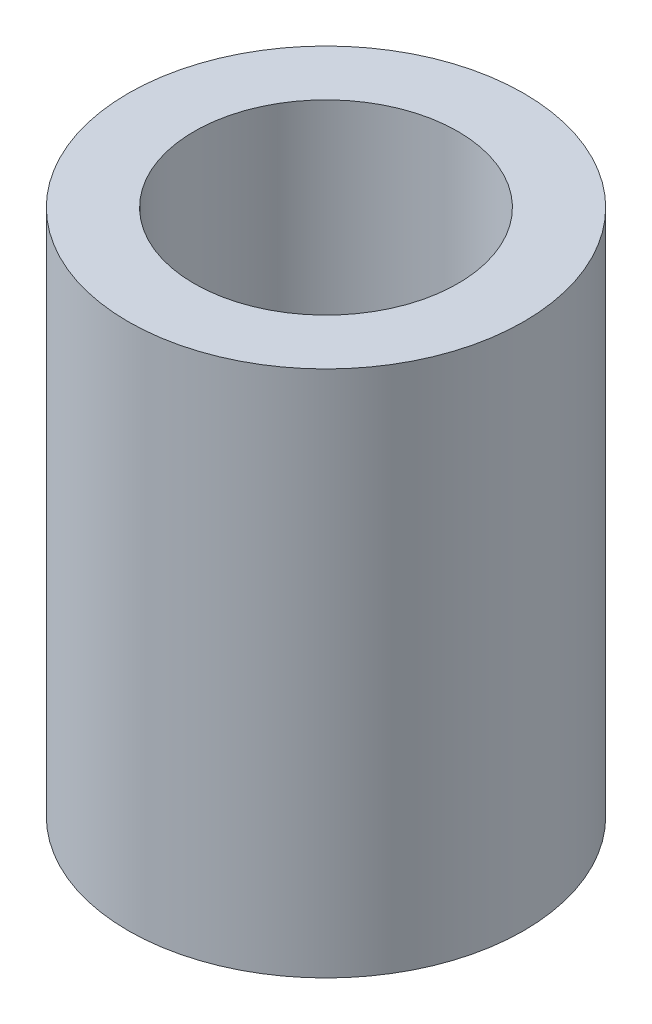
ISO-10303-21;
HEADER;
FILE_DESCRIPTION(('STEP AP214'),'2;1');
FILE_NAME('part.step','',(''),(''),'','','');
FILE_SCHEMA(('AUTOMOTIVE_DESIGN { 1 0 10303 214 1 1 1 1 }'));
ENDSEC;
DATA;
#1=APPLICATION_CONTEXT('core data for automotive mechanical design processes');
#2=APPLICATION_PROTOCOL_DEFINITION('international standard','automotive_design',2000,#1);
#3=PRODUCT_CONTEXT('',#1,'mechanical');
#4=PRODUCT('Part','Part','',(#3));
#5=PRODUCT_RELATED_PRODUCT_CATEGORY('part','',(#4));
#6=PRODUCT_DEFINITION_FORMATION('','',#4);
#7=PRODUCT_DEFINITION_CONTEXT('part definition',#1,'design');
#8=PRODUCT_DEFINITION('design','',#6,#7);
#9=PRODUCT_DEFINITION_SHAPE('','',#8);
#10=(LENGTH_UNIT() NAMED_UNIT(*) SI_UNIT(.MILLI.,.METRE.));
#11=(NAMED_UNIT(*) PLANE_ANGLE_UNIT() SI_UNIT($,.RADIAN.));
#12=(NAMED_UNIT(*) SI_UNIT($,.STERADIAN.) SOLID_ANGLE_UNIT());
#13=UNCERTAINTY_MEASURE_WITH_UNIT(LENGTH_MEASURE(1.E-05),#10,'distance_accuracy_value','');
#14=(GEOMETRIC_REPRESENTATION_CONTEXT(3) GLOBAL_UNCERTAINTY_ASSIGNED_CONTEXT((#13)) GLOBAL_UNIT_ASSIGNED_CONTEXT((#10,
#11,#12)) REPRESENTATION_CONTEXT('',''));
#15=CARTESIAN_POINT('',(0.,0.,0.));
#16=DIRECTION('',(0.,0.,1.));
#17=DIRECTION('',(1.,0.,0.));
#18=AXIS2_PLACEMENT_3D('',#15,#16,#17);
#19=CARTESIAN_POINT('',(0.,6.,0.));
#20=DIRECTION('',(0.,1.,0.));
#21=DIRECTION('',(0.,0.,1.));
#22=AXIS2_PLACEMENT_3D('',#19,#20,#21);
#23=PLANE('',#22);
#24=CARTESIAN_POINT('',(0.,6.,0.));
#25=DIRECTION('',(0.,1.,0.));
#26=DIRECTION('',(0.,0.,1.));
#27=AXIS2_PLACEMENT_3D('',#24,#25,#26);
#28=CIRCLE('',#27,2.25);
#29=CARTESIAN_POINT('',(0.,6.,2.25));
#30=VERTEX_POINT('',#29);
#31=EDGE_CURVE('E10',#30,#30,#28,.T.);
#32=ORIENTED_EDGE('',*,*,#31,.T.);
#33=EDGE_LOOP('',(#32));
#34=FACE_BOUND('',#33,.T.);
#35=CARTESIAN_POINT('',(0.,6.,0.));
#36=DIRECTION('',(0.,1.,0.));
#37=DIRECTION('',(0.,0.,1.));
#38=AXIS2_PLACEMENT_3D('',#35,#36,#37);
#39=CIRCLE('',#38,1.5);
#40=CARTESIAN_POINT('',(0.,6.,1.5));
#41=VERTEX_POINT('',#40);
#42=EDGE_CURVE('E41',#41,#41,#39,.T.);
#43=ORIENTED_EDGE('',*,*,#42,.F.);
#44=EDGE_LOOP('',(#43));
#45=FACE_BOUND('',#44,.T.);
#46=ADVANCED_FACE('F30',(#34,#45),#23,.T.);
#47=CARTESIAN_POINT('',(0.,0.,0.));
#48=DIRECTION('',(0.,1.,0.));
#49=DIRECTION('',(0.,0.,1.));
#50=AXIS2_PLACEMENT_3D('',#47,#48,#49);
#51=PLANE('',#50);
#52=CARTESIAN_POINT('',(0.,0.,0.));
#53=DIRECTION('',(0.,1.,0.));
#54=DIRECTION('',(0.,0.,1.));
#55=AXIS2_PLACEMENT_3D('',#52,#53,#54);
#56=CIRCLE('',#55,2.25);
#57=CARTESIAN_POINT('',(0.,0.,2.25));
#58=VERTEX_POINT('',#57);
#59=EDGE_CURVE('E34',#58,#58,#56,.T.);
#60=ORIENTED_EDGE('',*,*,#59,.F.);
#61=EDGE_LOOP('',(#60));
#62=FACE_BOUND('',#61,.T.);
#63=CARTESIAN_POINT('',(0.,0.,0.));
#64=DIRECTION('',(0.,1.,0.));
#65=DIRECTION('',(0.,0.,1.));
#66=AXIS2_PLACEMENT_3D('',#63,#64,#65);
#67=CIRCLE('',#66,1.5);
#68=CARTESIAN_POINT('',(0.,0.,1.5));
#69=VERTEX_POINT('',#68);
#70=EDGE_CURVE('E43',#69,#69,#67,.T.);
#71=ORIENTED_EDGE('',*,*,#70,.T.);
#72=EDGE_LOOP('',(#71));
#73=FACE_BOUND('',#72,.T.);
#74=ADVANCED_FACE('F53',(#62,#73),#51,.F.);
#75=CARTESIAN_POINT('',(0.,6.,0.));
#76=DIRECTION('',(0.,-1.,0.));
#77=DIRECTION('',(0.,0.,-1.));
#78=AXIS2_PLACEMENT_3D('',#75,#76,#77);
#79=CYLINDRICAL_SURFACE('',#78,2.25);
#80=ORIENTED_EDGE('',*,*,#31,.F.);
#81=EDGE_LOOP('',(#80));
#82=FACE_BOUND('',#81,.T.);
#83=ORIENTED_EDGE('',*,*,#59,.T.);
#84=EDGE_LOOP('',(#83));
#85=FACE_BOUND('',#84,.T.);
#86=ADVANCED_FACE('F32',(#82,#85),#79,.T.);
#87=CARTESIAN_POINT('',(0.,6.,0.));
#88=DIRECTION('',(0.,-1.,0.));
#89=DIRECTION('',(0.,0.,-1.));
#90=AXIS2_PLACEMENT_3D('',#87,#88,#89);
#91=CYLINDRICAL_SURFACE('',#90,1.5);
#92=ORIENTED_EDGE('',*,*,#42,.T.);
#93=EDGE_LOOP('',(#92));
#94=FACE_BOUND('',#93,.T.);
#95=ORIENTED_EDGE('',*,*,#70,.F.);
#96=EDGE_LOOP('',(#95));
#97=FACE_BOUND('',#96,.T.);
#98=ADVANCED_FACE('F49',(#94,#97),#91,.F.);
#99=CLOSED_SHELL('',(#46,#74,#86,#98));
#100=MANIFOLD_SOLID_BREP('B2',#99);
#101=ADVANCED_BREP_SHAPE_REPRESENTATION('',(#18,#100),#14);
#102=SHAPE_DEFINITION_REPRESENTATION(#9,#101);
ENDSEC;
END-ISO-10303-21;
